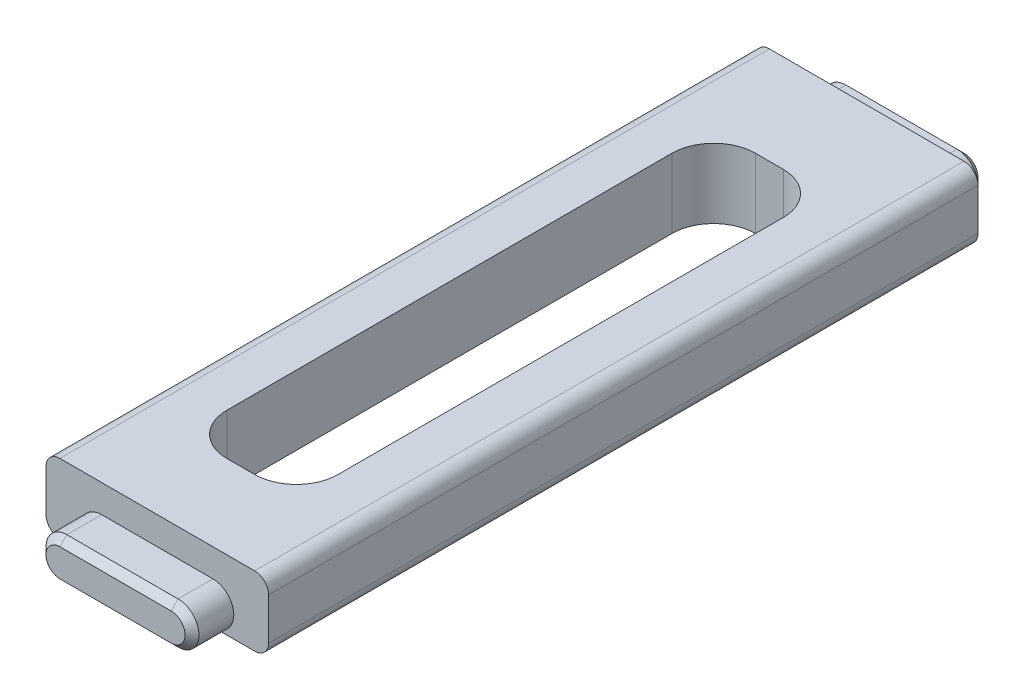
ISO-10303-21;
HEADER;
FILE_DESCRIPTION(('STEP AP214'),'2;1');
FILE_NAME('part.step','',(''),(''),'','','');
FILE_SCHEMA(('AUTOMOTIVE_DESIGN { 1 0 10303 214 1 1 1 1 }'));
ENDSEC;
DATA;
#1=APPLICATION_CONTEXT('core data for automotive mechanical design processes');
#2=APPLICATION_PROTOCOL_DEFINITION('international standard','automotive_design',2000,#1);
#3=PRODUCT_CONTEXT('',#1,'mechanical');
#4=PRODUCT('Part','Part','',(#3));
#5=PRODUCT_RELATED_PRODUCT_CATEGORY('part','',(#4));
#6=PRODUCT_DEFINITION_FORMATION('','',#4);
#7=PRODUCT_DEFINITION_CONTEXT('part definition',#1,'design');
#8=PRODUCT_DEFINITION('design','',#6,#7);
#9=PRODUCT_DEFINITION_SHAPE('','',#8);
#10=(LENGTH_UNIT() NAMED_UNIT(*) SI_UNIT(.MILLI.,.METRE.));
#11=(NAMED_UNIT(*) PLANE_ANGLE_UNIT() SI_UNIT($,.RADIAN.));
#12=(NAMED_UNIT(*) SI_UNIT($,.STERADIAN.) SOLID_ANGLE_UNIT());
#13=UNCERTAINTY_MEASURE_WITH_UNIT(LENGTH_MEASURE(1.E-05),#10,'distance_accuracy_value','');
#14=(GEOMETRIC_REPRESENTATION_CONTEXT(3) GLOBAL_UNCERTAINTY_ASSIGNED_CONTEXT((#13)) GLOBAL_UNIT_ASSIGNED_CONTEXT((#10,
#11,#12)) REPRESENTATION_CONTEXT('',''));
#15=CARTESIAN_POINT('',(0.,0.,0.));
#16=DIRECTION('',(0.,0.,1.));
#17=DIRECTION('',(1.,0.,0.));
#18=AXIS2_PLACEMENT_3D('',#15,#16,#17);
#19=CARTESIAN_POINT('',(-4.,0.,3.));
#20=DIRECTION('',(0.,0.,-1.));
#21=DIRECTION('',(-1.,0.,0.));
#22=AXIS2_PLACEMENT_3D('',#19,#20,#21);
#23=CYLINDRICAL_SURFACE('',#22,1.5);
#24=DIRECTION('',(0.,0.,-1.));
#25=VECTOR('',#24,1.);
#26=CARTESIAN_POINT('',(-4.,-1.5,3.));
#27=LINE('',#26,#25);
#28=CARTESIAN_POINT('',(-4.,-1.5,2.5));
#29=VERTEX_POINT('',#28);
#30=CARTESIAN_POINT('',(-4.,-1.5,0.));
#31=VERTEX_POINT('',#30);
#32=EDGE_CURVE('E294',#29,#31,#27,.T.);
#33=ORIENTED_EDGE('',*,*,#32,.F.);
#34=CARTESIAN_POINT('',(-4.,0.,2.5));
#35=DIRECTION('',(0.,0.,1.));
#36=DIRECTION('',(1.,0.,0.));
#37=AXIS2_PLACEMENT_3D('',#34,#35,#36);
#38=CIRCLE('',#37,1.5);
#39=CARTESIAN_POINT('',(-4.,1.5,2.5));
#40=VERTEX_POINT('',#39);
#41=EDGE_CURVE('E350',#29,#40,#38,.F.);
#42=ORIENTED_EDGE('',*,*,#41,.T.);
#43=DIRECTION('',(0.,0.,-1.));
#44=VECTOR('',#43,1.);
#45=CARTESIAN_POINT('',(-4.,1.5,3.));
#46=LINE('',#45,#44);
#47=CARTESIAN_POINT('',(-4.,1.5,0.));
#48=VERTEX_POINT('',#47);
#49=EDGE_CURVE('E288',#40,#48,#46,.T.);
#50=ORIENTED_EDGE('',*,*,#49,.T.);
#51=CARTESIAN_POINT('',(-4.,0.,0.));
#52=DIRECTION('',(0.,0.,1.));
#53=DIRECTION('',(1.,0.,0.));
#54=AXIS2_PLACEMENT_3D('',#51,#52,#53);
#55=CIRCLE('',#54,1.5);
#56=EDGE_CURVE('E268',#48,#31,#55,.T.);
#57=ORIENTED_EDGE('',*,*,#56,.T.);
#58=EDGE_LOOP('',(#33,#42,#50,#57));
#59=FACE_BOUND('',#58,.T.);
#60=ADVANCED_FACE('F34',(#59),#23,.T.);
#61=CARTESIAN_POINT('',(-4.,-1.5,3.));
#62=DIRECTION('',(0.,1.,0.));
#63=DIRECTION('',(0.,0.,1.));
#64=AXIS2_PLACEMENT_3D('',#61,#62,#63);
#65=PLANE('',#64);
#66=DIRECTION('',(-1.,0.,0.));
#67=VECTOR('',#66,1.);
#68=CARTESIAN_POINT('',(-4.,-1.5,-6.00000000000001));
#69=LINE('',#68,#67);
#70=CARTESIAN_POINT('',(1.,-1.5,-6.00000000000001));
#71=VERTEX_POINT('',#70);
#72=CARTESIAN_POINT('',(-0.999999999999997,-1.5,-6.00000000000001));
#73=VERTEX_POINT('',#72);
#74=EDGE_CURVE('E423',#71,#73,#69,.T.);
#75=ORIENTED_EDGE('',*,*,#74,.F.);
#76=CARTESIAN_POINT('',(1.,-1.5,-9.00000000000001));
#77=DIRECTION('',(0.,1.,0.));
#78=DIRECTION('',(0.,0.,1.));
#79=AXIS2_PLACEMENT_3D('',#76,#77,#78);
#80=CIRCLE('',#79,3.);
#81=CARTESIAN_POINT('',(4.,-1.5,-9.));
#82=VERTEX_POINT('',#81);
#83=EDGE_CURVE('E42',#71,#82,#80,.T.);
#84=ORIENTED_EDGE('',*,*,#83,.T.);
#85=DIRECTION('',(0.,0.,1.));
#86=VECTOR('',#85,1.);
#87=CARTESIAN_POINT('',(4.,-1.5,-44.));
#88=LINE('',#87,#86);
#89=CARTESIAN_POINT('',(4.,-1.5,-41.));
#90=VERTEX_POINT('',#89);
#91=EDGE_CURVE('E422',#90,#82,#88,.T.);
#92=ORIENTED_EDGE('',*,*,#91,.F.);
#93=CARTESIAN_POINT('',(1.,-1.5,-41.));
#94=DIRECTION('',(0.,1.,0.));
#95=DIRECTION('',(0.,0.,1.));
#96=AXIS2_PLACEMENT_3D('',#93,#94,#95);
#97=CIRCLE('',#96,3.);
#98=CARTESIAN_POINT('',(1.,-1.5,-44.));
#99=VERTEX_POINT('',#98);
#100=EDGE_CURVE('E409',#90,#99,#97,.T.);
#101=ORIENTED_EDGE('',*,*,#100,.T.);
#102=DIRECTION('',(1.,0.,0.));
#103=VECTOR('',#102,1.);
#104=CARTESIAN_POINT('',(-4.,-1.5,-44.));
#105=LINE('',#104,#103);
#106=CARTESIAN_POINT('',(-0.999999999999997,-1.5,-44.));
#107=VERTEX_POINT('',#106);
#108=EDGE_CURVE('E440',#107,#99,#105,.T.);
#109=ORIENTED_EDGE('',*,*,#108,.F.);
#110=CARTESIAN_POINT('',(-0.999999999999997,-1.5,-41.));
#111=DIRECTION('',(0.,1.,0.));
#112=DIRECTION('',(0.,0.,1.));
#113=AXIS2_PLACEMENT_3D('',#110,#111,#112);
#114=CIRCLE('',#113,3.);
#115=CARTESIAN_POINT('',(-4.,-1.5,-41.));
#116=VERTEX_POINT('',#115);
#117=EDGE_CURVE('E405',#107,#116,#114,.T.);
#118=ORIENTED_EDGE('',*,*,#117,.T.);
#119=DIRECTION('',(0.,0.,-1.));
#120=VECTOR('',#119,1.);
#121=CARTESIAN_POINT('',(-4.,-1.5,-44.));
#122=LINE('',#121,#120);
#123=CARTESIAN_POINT('',(-4.,-1.5,-9.));
#124=VERTEX_POINT('',#123);
#125=EDGE_CURVE('E446',#124,#116,#122,.T.);
#126=ORIENTED_EDGE('',*,*,#125,.F.);
#127=CARTESIAN_POINT('',(-0.999999999999997,-1.5,-9.));
#128=DIRECTION('',(0.,1.,0.));
#129=DIRECTION('',(0.,0.,1.));
#130=AXIS2_PLACEMENT_3D('',#127,#128,#129);
#131=CIRCLE('',#130,3.);
#132=EDGE_CURVE('E413',#124,#73,#131,.T.);
#133=ORIENTED_EDGE('',*,*,#132,.T.);
#134=EDGE_LOOP('',(#75,#84,#92,#101,#109,#118,#126,#133));
#135=FACE_BOUND('',#134,.T.);
#136=DIRECTION('',(0.,0.,-1.));
#137=VECTOR('',#136,1.);
#138=CARTESIAN_POINT('',(4.,-1.5,3.));
#139=LINE('',#138,#137);
#140=CARTESIAN_POINT('',(4.,-1.5,2.5));
#141=VERTEX_POINT('',#140);
#142=CARTESIAN_POINT('',(4.,-1.5,0.));
#143=VERTEX_POINT('',#142);
#144=EDGE_CURVE('E292',#141,#143,#139,.T.);
#145=ORIENTED_EDGE('',*,*,#144,.F.);
#146=DIRECTION('',(-1.,0.,0.));
#147=VECTOR('',#146,1.);
#148=CARTESIAN_POINT('',(-4.,-1.5,2.5));
#149=LINE('',#148,#147);
#150=EDGE_CURVE('E348',#141,#29,#149,.T.);
#151=ORIENTED_EDGE('',*,*,#150,.T.);
#152=ORIENTED_EDGE('',*,*,#32,.T.);
#153=DIRECTION('',(-1.,0.,0.));
#154=VECTOR('',#153,1.);
#155=CARTESIAN_POINT('',(-8.,-1.5,0.));
#156=LINE('',#155,#154);
#157=CARTESIAN_POINT('',(-7.,-1.5,0.));
#158=VERTEX_POINT('',#157);
#159=EDGE_CURVE('E277',#31,#158,#156,.T.);
#160=ORIENTED_EDGE('',*,*,#159,.T.);
#161=DIRECTION('',(0.,0.,1.));
#162=VECTOR('',#161,1.);
#163=CARTESIAN_POINT('',(-7.,-1.5,3.));
#164=LINE('',#163,#162);
#165=CARTESIAN_POINT('',(-7.,-1.5,-51.));
#166=VERTEX_POINT('',#165);
#167=EDGE_CURVE('E296',#158,#166,#164,.F.);
#168=ORIENTED_EDGE('',*,*,#167,.T.);
#169=DIRECTION('',(-1.,0.,0.));
#170=VECTOR('',#169,1.);
#171=CARTESIAN_POINT('',(-8.,-1.5,-51.));
#172=LINE('',#171,#170);
#173=CARTESIAN_POINT('',(-4.,-1.5,-51.));
#174=VERTEX_POINT('',#173);
#175=EDGE_CURVE('E265',#174,#166,#172,.T.);
#176=ORIENTED_EDGE('',*,*,#175,.F.);
#177=DIRECTION('',(0.,0.,1.));
#178=VECTOR('',#177,1.);
#179=CARTESIAN_POINT('',(-4.,-1.5,-54.));
#180=LINE('',#179,#178);
#181=CARTESIAN_POINT('',(-4.,-1.5,-53.5));
#182=VERTEX_POINT('',#181);
#183=EDGE_CURVE('E229',#182,#174,#180,.T.);
#184=ORIENTED_EDGE('',*,*,#183,.F.);
#185=DIRECTION('',(1.,0.,0.));
#186=VECTOR('',#185,1.);
#187=CARTESIAN_POINT('',(4.,-1.5,-53.5));
#188=LINE('',#187,#186);
#189=CARTESIAN_POINT('',(4.,-1.5,-53.5));
#190=VERTEX_POINT('',#189);
#191=EDGE_CURVE('E346',#182,#190,#188,.T.);
#192=ORIENTED_EDGE('',*,*,#191,.T.);
#193=DIRECTION('',(0.,0.,1.));
#194=VECTOR('',#193,1.);
#195=CARTESIAN_POINT('',(4.,-1.5,-54.));
#196=LINE('',#195,#194);
#197=CARTESIAN_POINT('',(4.,-1.5,-51.));
#198=VERTEX_POINT('',#197);
#199=EDGE_CURVE('E253',#190,#198,#196,.T.);
#200=ORIENTED_EDGE('',*,*,#199,.T.);
#201=CARTESIAN_POINT('',(7.,-1.5,-51.));
#202=VERTEX_POINT('',#201);
#203=EDGE_CURVE('E266',#202,#198,#172,.T.);
#204=ORIENTED_EDGE('',*,*,#203,.F.);
#205=DIRECTION('',(0.,0.,1.));
#206=VECTOR('',#205,1.);
#207=CARTESIAN_POINT('',(7.,-1.5,3.));
#208=LINE('',#207,#206);
#209=CARTESIAN_POINT('',(7.,-1.5,0.));
#210=VERTEX_POINT('',#209);
#211=EDGE_CURVE('E298',#202,#210,#208,.T.);
#212=ORIENTED_EDGE('',*,*,#211,.T.);
#213=EDGE_CURVE('E260',#210,#143,#156,.T.);
#214=ORIENTED_EDGE('',*,*,#213,.T.);
#215=EDGE_LOOP('',(#145,#151,#152,#160,#168,#176,#184,#192,#200,#204,#212,#214));
#216=FACE_BOUND('',#215,.T.);
#217=ADVANCED_FACE('F420',(#135,#216),#65,.F.);
#218=CARTESIAN_POINT('',(4.,0.,3.));
#219=DIRECTION('',(0.,0.,-1.));
#220=DIRECTION('',(-1.,0.,0.));
#221=AXIS2_PLACEMENT_3D('',#218,#219,#220);
#222=CYLINDRICAL_SURFACE('',#221,1.5);
#223=DIRECTION('',(0.,0.,-1.));
#224=VECTOR('',#223,1.);
#225=CARTESIAN_POINT('',(4.,1.5,3.));
#226=LINE('',#225,#224);
#227=CARTESIAN_POINT('',(4.,1.5,2.5));
#228=VERTEX_POINT('',#227);
#229=CARTESIAN_POINT('',(4.,1.5,0.));
#230=VERTEX_POINT('',#229);
#231=EDGE_CURVE('E290',#228,#230,#226,.T.);
#232=ORIENTED_EDGE('',*,*,#231,.F.);
#233=CARTESIAN_POINT('',(4.,0.,2.5));
#234=DIRECTION('',(0.,0.,1.));
#235=DIRECTION('',(1.,0.,0.));
#236=AXIS2_PLACEMENT_3D('',#233,#234,#235);
#237=CIRCLE('',#236,1.5);
#238=EDGE_CURVE('E344',#228,#141,#237,.F.);
#239=ORIENTED_EDGE('',*,*,#238,.T.);
#240=ORIENTED_EDGE('',*,*,#144,.T.);
#241=CARTESIAN_POINT('',(4.,0.,0.));
#242=DIRECTION('',(0.,0.,1.));
#243=DIRECTION('',(1.,0.,0.));
#244=AXIS2_PLACEMENT_3D('',#241,#242,#243);
#245=CIRCLE('',#244,1.5);
#246=EDGE_CURVE('E282',#143,#230,#245,.T.);
#247=ORIENTED_EDGE('',*,*,#246,.T.);
#248=EDGE_LOOP('',(#232,#239,#240,#247));
#249=FACE_BOUND('',#248,.T.);
#250=ADVANCED_FACE('F483',(#249),#222,.T.);
#251=CARTESIAN_POINT('',(-4.,1.5,3.));
#252=DIRECTION('',(0.,-1.,0.));
#253=DIRECTION('',(1.,0.,0.));
#254=AXIS2_PLACEMENT_3D('',#251,#252,#253);
#255=PLANE('',#254);
#256=ORIENTED_EDGE('',*,*,#49,.F.);
#257=DIRECTION('',(1.,0.,0.));
#258=VECTOR('',#257,1.);
#259=CARTESIAN_POINT('',(4.,1.5,2.5));
#260=LINE('',#259,#258);
#261=EDGE_CURVE('E341',#40,#228,#260,.T.);
#262=ORIENTED_EDGE('',*,*,#261,.T.);
#263=ORIENTED_EDGE('',*,*,#231,.T.);
#264=DIRECTION('',(-1.,0.,0.));
#265=VECTOR('',#264,1.);
#266=CARTESIAN_POINT('',(-4.,1.5,0.));
#267=LINE('',#266,#265);
#268=EDGE_CURVE('E285',#230,#48,#267,.T.);
#269=ORIENTED_EDGE('',*,*,#268,.T.);
#270=EDGE_LOOP('',(#256,#262,#263,#269));
#271=FACE_BOUND('',#270,.T.);
#272=ADVANCED_FACE('F580',(#271),#255,.F.);
#273=CARTESIAN_POINT('',(-4.,0.,3.));
#274=DIRECTION('',(0.,0.,1.));
#275=DIRECTION('',(1.,0.,0.));
#276=AXIS2_PLACEMENT_3D('',#273,#274,#275);
#277=PLANE('',#276);
#278=CARTESIAN_POINT('',(4.,0.,3.));
#279=DIRECTION('',(0.,0.,1.));
#280=DIRECTION('',(1.,0.,0.));
#281=AXIS2_PLACEMENT_3D('',#278,#279,#280);
#282=CIRCLE('',#281,1.);
#283=CARTESIAN_POINT('',(4.,-1.,3.));
#284=VERTEX_POINT('',#283);
#285=CARTESIAN_POINT('',(4.,1.,3.));
#286=VERTEX_POINT('',#285);
#287=EDGE_CURVE('E336',#284,#286,#282,.T.);
#288=ORIENTED_EDGE('',*,*,#287,.T.);
#289=DIRECTION('',(-1.,0.,0.));
#290=VECTOR('',#289,1.);
#291=CARTESIAN_POINT('',(-4.,1.,3.));
#292=LINE('',#291,#290);
#293=CARTESIAN_POINT('',(-4.,1.,3.));
#294=VERTEX_POINT('',#293);
#295=EDGE_CURVE('E338',#286,#294,#292,.T.);
#296=ORIENTED_EDGE('',*,*,#295,.T.);
#297=CARTESIAN_POINT('',(-4.,0.,3.));
#298=DIRECTION('',(0.,0.,1.));
#299=DIRECTION('',(1.,0.,0.));
#300=AXIS2_PLACEMENT_3D('',#297,#298,#299);
#301=CIRCLE('',#300,1.);
#302=CARTESIAN_POINT('',(-4.,-1.,3.));
#303=VERTEX_POINT('',#302);
#304=EDGE_CURVE('E332',#294,#303,#301,.T.);
#305=ORIENTED_EDGE('',*,*,#304,.T.);
#306=DIRECTION('',(1.,0.,0.));
#307=VECTOR('',#306,1.);
#308=CARTESIAN_POINT('',(4.,-1.,3.));
#309=LINE('',#308,#307);
#310=EDGE_CURVE('E334',#303,#284,#309,.T.);
#311=ORIENTED_EDGE('',*,*,#310,.T.);
#312=EDGE_LOOP('',(#288,#296,#305,#311));
#313=FACE_BOUND('',#312,.T.);
#314=ADVANCED_FACE('F576',(#313),#277,.T.);
#315=CARTESIAN_POINT('',(-8.,3.5,-51.));
#316=DIRECTION('',(1.,0.,0.));
#317=DIRECTION('',(0.,0.,-1.));
#318=AXIS2_PLACEMENT_3D('',#315,#316,#317);
#319=PLANE('',#318);
#320=DIRECTION('',(0.,1.,0.));
#321=VECTOR('',#320,1.);
#322=CARTESIAN_POINT('',(-8.,3.5,-51.));
#323=LINE('',#322,#321);
#324=CARTESIAN_POINT('',(-8.,-0.5,-51.));
#325=VERTEX_POINT('',#324);
#326=CARTESIAN_POINT('',(-8.,2.5,-51.));
#327=VERTEX_POINT('',#326);
#328=EDGE_CURVE('E256',#325,#327,#323,.T.);
#329=ORIENTED_EDGE('',*,*,#328,.F.);
#330=DIRECTION('',(0.,0.,1.));
#331=VECTOR('',#330,1.);
#332=CARTESIAN_POINT('',(-8.,-0.5,-51.));
#333=LINE('',#332,#331);
#334=CARTESIAN_POINT('',(-8.,-0.5,0.));
#335=VERTEX_POINT('',#334);
#336=EDGE_CURVE('E324',#325,#335,#333,.T.);
#337=ORIENTED_EDGE('',*,*,#336,.T.);
#338=DIRECTION('',(0.,1.,0.));
#339=VECTOR('',#338,1.);
#340=CARTESIAN_POINT('',(-8.,3.5,0.));
#341=LINE('',#340,#339);
#342=CARTESIAN_POINT('',(-8.,2.5,0.));
#343=VERTEX_POINT('',#342);
#344=EDGE_CURVE('E255',#335,#343,#341,.T.);
#345=ORIENTED_EDGE('',*,*,#344,.T.);
#346=DIRECTION('',(0.,0.,1.));
#347=VECTOR('',#346,1.);
#348=CARTESIAN_POINT('',(-8.,2.5,-51.));
#349=LINE('',#348,#347);
#350=EDGE_CURVE('E322',#343,#327,#349,.F.);
#351=ORIENTED_EDGE('',*,*,#350,.T.);
#352=EDGE_LOOP('',(#329,#337,#345,#351));
#353=FACE_BOUND('',#352,.T.);
#354=ADVANCED_FACE('F573',(#353),#319,.F.);
#355=CARTESIAN_POINT('',(8.,3.5,-51.));
#356=DIRECTION('',(0.,-1.,0.));
#357=DIRECTION('',(0.,0.,-1.));
#358=AXIS2_PLACEMENT_3D('',#355,#356,#357);
#359=PLANE('',#358);
#360=DIRECTION('',(0.,0.,-1.));
#361=VECTOR('',#360,1.);
#362=CARTESIAN_POINT('',(-4.,3.5,-44.));
#363=LINE('',#362,#361);
#364=CARTESIAN_POINT('',(-4.,3.5,-9.));
#365=VERTEX_POINT('',#364);
#366=CARTESIAN_POINT('',(-4.,3.5,-41.));
#367=VERTEX_POINT('',#366);
#368=EDGE_CURVE('E435',#365,#367,#363,.T.);
#369=ORIENTED_EDGE('',*,*,#368,.T.);
#370=CARTESIAN_POINT('',(-0.999999999999997,3.5,-41.));
#371=DIRECTION('',(0.,-1.,0.));
#372=DIRECTION('',(0.,0.,-1.));
#373=AXIS2_PLACEMENT_3D('',#370,#371,#372);
#374=CIRCLE('',#373,3.);
#375=CARTESIAN_POINT('',(-0.999999999999997,3.5,-44.));
#376=VERTEX_POINT('',#375);
#377=EDGE_CURVE('E407',#367,#376,#374,.T.);
#378=ORIENTED_EDGE('',*,*,#377,.T.);
#379=DIRECTION('',(1.,0.,0.));
#380=VECTOR('',#379,1.);
#381=CARTESIAN_POINT('',(-4.,3.5,-44.));
#382=LINE('',#381,#380);
#383=CARTESIAN_POINT('',(1.,3.5,-44.));
#384=VERTEX_POINT('',#383);
#385=EDGE_CURVE('E380',#376,#384,#382,.T.);
#386=ORIENTED_EDGE('',*,*,#385,.T.);
#387=CARTESIAN_POINT('',(1.,3.5,-41.));
#388=DIRECTION('',(0.,-1.,0.));
#389=DIRECTION('',(0.,0.,-1.));
#390=AXIS2_PLACEMENT_3D('',#387,#388,#389);
#391=CIRCLE('',#390,3.);
#392=CARTESIAN_POINT('',(4.,3.5,-41.));
#393=VERTEX_POINT('',#392);
#394=EDGE_CURVE('E411',#384,#393,#391,.T.);
#395=ORIENTED_EDGE('',*,*,#394,.T.);
#396=DIRECTION('',(0.,0.,1.));
#397=VECTOR('',#396,1.);
#398=CARTESIAN_POINT('',(4.,3.5,-44.));
#399=LINE('',#398,#397);
#400=CARTESIAN_POINT('',(4.,3.5,-9.));
#401=VERTEX_POINT('',#400);
#402=EDGE_CURVE('E436',#393,#401,#399,.T.);
#403=ORIENTED_EDGE('',*,*,#402,.T.);
#404=CARTESIAN_POINT('',(1.,3.5,-9.00000000000001));
#405=DIRECTION('',(0.,-1.,0.));
#406=DIRECTION('',(0.,0.,-1.));
#407=AXIS2_PLACEMENT_3D('',#404,#405,#406);
#408=CIRCLE('',#407,3.);
#409=CARTESIAN_POINT('',(1.,3.5,-6.00000000000001));
#410=VERTEX_POINT('',#409);
#411=EDGE_CURVE('E11',#401,#410,#408,.T.);
#412=ORIENTED_EDGE('',*,*,#411,.T.);
#413=DIRECTION('',(-1.,0.,0.));
#414=VECTOR('',#413,1.);
#415=CARTESIAN_POINT('',(-4.,3.5,-6.00000000000001));
#416=LINE('',#415,#414);
#417=CARTESIAN_POINT('',(-0.999999999999997,3.5,-6.00000000000001));
#418=VERTEX_POINT('',#417);
#419=EDGE_CURVE('E433',#410,#418,#416,.T.);
#420=ORIENTED_EDGE('',*,*,#419,.T.);
#421=CARTESIAN_POINT('',(-0.999999999999997,3.5,-9.));
#422=DIRECTION('',(0.,-1.,0.));
#423=DIRECTION('',(0.,0.,-1.));
#424=AXIS2_PLACEMENT_3D('',#421,#422,#423);
#425=CIRCLE('',#424,3.);
#426=EDGE_CURVE('E415',#418,#365,#425,.T.);
#427=ORIENTED_EDGE('',*,*,#426,.T.);
#428=EDGE_LOOP('',(#369,#378,#386,#395,#403,#412,#420,#427));
#429=FACE_BOUND('',#428,.T.);
#430=DIRECTION('',(1.,0.,0.));
#431=VECTOR('',#430,1.);
#432=CARTESIAN_POINT('',(8.,3.5,0.));
#433=LINE('',#432,#431);
#434=CARTESIAN_POINT('',(-7.,3.5,0.));
#435=VERTEX_POINT('',#434);
#436=CARTESIAN_POINT('',(7.,3.5,0.));
#437=VERTEX_POINT('',#436);
#438=EDGE_CURVE('E271',#435,#437,#433,.T.);
#439=ORIENTED_EDGE('',*,*,#438,.T.);
#440=DIRECTION('',(0.,0.,1.));
#441=VECTOR('',#440,1.);
#442=CARTESIAN_POINT('',(7.,3.5,-51.));
#443=LINE('',#442,#441);
#444=CARTESIAN_POINT('',(7.,3.5,-51.));
#445=VERTEX_POINT('',#444);
#446=EDGE_CURVE('E330',#437,#445,#443,.F.);
#447=ORIENTED_EDGE('',*,*,#446,.T.);
#448=DIRECTION('',(1.,0.,0.));
#449=VECTOR('',#448,1.);
#450=CARTESIAN_POINT('',(8.,3.5,-51.));
#451=LINE('',#450,#449);
#452=CARTESIAN_POINT('',(-7.,3.5,-51.));
#453=VERTEX_POINT('',#452);
#454=EDGE_CURVE('E259',#453,#445,#451,.T.);
#455=ORIENTED_EDGE('',*,*,#454,.F.);
#456=DIRECTION('',(0.,0.,1.));
#457=VECTOR('',#456,1.);
#458=CARTESIAN_POINT('',(-7.,3.5,-51.));
#459=LINE('',#458,#457);
#460=EDGE_CURVE('E327',#453,#435,#459,.T.);
#461=ORIENTED_EDGE('',*,*,#460,.T.);
#462=EDGE_LOOP('',(#439,#447,#455,#461));
#463=FACE_BOUND('',#462,.T.);
#464=ADVANCED_FACE('F458',(#429,#463),#359,.F.);
#465=CARTESIAN_POINT('',(8.,-1.5,-51.));
#466=DIRECTION('',(-1.,0.,0.));
#467=DIRECTION('',(0.,0.,1.));
#468=AXIS2_PLACEMENT_3D('',#465,#466,#467);
#469=PLANE('',#468);
#470=DIRECTION('',(0.,-1.,0.));
#471=VECTOR('',#470,1.);
#472=CARTESIAN_POINT('',(8.,-1.5,0.));
#473=LINE('',#472,#471);
#474=CARTESIAN_POINT('',(8.,2.5,0.));
#475=VERTEX_POINT('',#474);
#476=CARTESIAN_POINT('',(8.,-0.500000000000001,0.));
#477=VERTEX_POINT('',#476);
#478=EDGE_CURVE('E274',#475,#477,#473,.T.);
#479=ORIENTED_EDGE('',*,*,#478,.T.);
#480=DIRECTION('',(0.,0.,1.));
#481=VECTOR('',#480,1.);
#482=CARTESIAN_POINT('',(8.,-0.500000000000001,-51.));
#483=LINE('',#482,#481);
#484=CARTESIAN_POINT('',(8.,-0.500000000000001,-51.));
#485=VERTEX_POINT('',#484);
#486=EDGE_CURVE('E312',#477,#485,#483,.F.);
#487=ORIENTED_EDGE('',*,*,#486,.T.);
#488=DIRECTION('',(0.,-1.,0.));
#489=VECTOR('',#488,1.);
#490=CARTESIAN_POINT('',(8.,-1.5,-51.));
#491=LINE('',#490,#489);
#492=CARTESIAN_POINT('',(8.,2.5,-51.));
#493=VERTEX_POINT('',#492);
#494=EDGE_CURVE('E263',#493,#485,#491,.T.);
#495=ORIENTED_EDGE('',*,*,#494,.F.);
#496=DIRECTION('',(0.,0.,1.));
#497=VECTOR('',#496,1.);
#498=CARTESIAN_POINT('',(8.,2.5,-51.));
#499=LINE('',#498,#497);
#500=EDGE_CURVE('E309',#493,#475,#499,.T.);
#501=ORIENTED_EDGE('',*,*,#500,.T.);
#502=EDGE_LOOP('',(#479,#487,#495,#501));
#503=FACE_BOUND('',#502,.T.);
#504=ADVANCED_FACE('F564',(#503),#469,.F.);
#505=CARTESIAN_POINT('',(0.,0.,-51.));
#506=DIRECTION('',(0.,0.,1.));
#507=DIRECTION('',(1.,0.,0.));
#508=AXIS2_PLACEMENT_3D('',#505,#506,#507);
#509=PLANE('',#508);
#510=ORIENTED_EDGE('',*,*,#494,.T.);
#511=CARTESIAN_POINT('',(7.,-0.500000000000001,-51.));
#512=DIRECTION('',(0.,0.,1.));
#513=DIRECTION('',(1.,0.,0.));
#514=AXIS2_PLACEMENT_3D('',#511,#512,#513);
#515=CIRCLE('',#514,1.);
#516=EDGE_CURVE('E320',#485,#202,#515,.F.);
#517=ORIENTED_EDGE('',*,*,#516,.T.);
#518=ORIENTED_EDGE('',*,*,#203,.T.);
#519=CARTESIAN_POINT('',(4.,0.,-51.));
#520=DIRECTION('',(0.,0.,-1.));
#521=DIRECTION('',(-1.,0.,0.));
#522=AXIS2_PLACEMENT_3D('',#519,#520,#521);
#523=CIRCLE('',#522,1.5);
#524=CARTESIAN_POINT('',(4.,1.5,-51.));
#525=VERTEX_POINT('',#524);
#526=EDGE_CURVE('E242',#525,#198,#523,.T.);
#527=ORIENTED_EDGE('',*,*,#526,.F.);
#528=DIRECTION('',(1.,0.,0.));
#529=VECTOR('',#528,1.);
#530=CARTESIAN_POINT('',(4.,1.5,-51.));
#531=LINE('',#530,#529);
#532=CARTESIAN_POINT('',(-4.,1.5,-51.));
#533=VERTEX_POINT('',#532);
#534=EDGE_CURVE('E224',#533,#525,#531,.T.);
#535=ORIENTED_EDGE('',*,*,#534,.F.);
#536=CARTESIAN_POINT('',(-4.,0.,-51.));
#537=DIRECTION('',(0.,0.,-1.));
#538=DIRECTION('',(-1.,0.,0.));
#539=AXIS2_PLACEMENT_3D('',#536,#537,#538);
#540=CIRCLE('',#539,1.5);
#541=EDGE_CURVE('E238',#174,#533,#540,.T.);
#542=ORIENTED_EDGE('',*,*,#541,.F.);
#543=ORIENTED_EDGE('',*,*,#175,.T.);
#544=CARTESIAN_POINT('',(-7.,-0.5,-51.));
#545=DIRECTION('',(0.,0.,1.));
#546=DIRECTION('',(1.,0.,0.));
#547=AXIS2_PLACEMENT_3D('',#544,#545,#546);
#548=CIRCLE('',#547,1.);
#549=EDGE_CURVE('E318',#166,#325,#548,.F.);
#550=ORIENTED_EDGE('',*,*,#549,.T.);
#551=ORIENTED_EDGE('',*,*,#328,.T.);
#552=CARTESIAN_POINT('',(-7.,2.5,-51.));
#553=DIRECTION('',(0.,0.,1.));
#554=DIRECTION('',(1.,0.,0.));
#555=AXIS2_PLACEMENT_3D('',#552,#553,#554);
#556=CIRCLE('',#555,1.);
#557=EDGE_CURVE('E314',#327,#453,#556,.F.);
#558=ORIENTED_EDGE('',*,*,#557,.T.);
#559=ORIENTED_EDGE('',*,*,#454,.T.);
#560=CARTESIAN_POINT('',(7.,2.5,-51.));
#561=DIRECTION('',(0.,0.,1.));
#562=DIRECTION('',(1.,0.,0.));
#563=AXIS2_PLACEMENT_3D('',#560,#561,#562);
#564=CIRCLE('',#563,1.);
#565=EDGE_CURVE('E316',#445,#493,#564,.F.);
#566=ORIENTED_EDGE('',*,*,#565,.T.);
#567=EDGE_LOOP('',(#510,#517,#518,#527,#535,#542,#543,#550,#551,#558,#559,#566));
#568=FACE_BOUND('',#567,.T.);
#569=ADVANCED_FACE('F236',(#568),#509,.F.);
#570=CARTESIAN_POINT('',(0.,0.,0.));
#571=DIRECTION('',(0.,0.,1.));
#572=DIRECTION('',(1.,0.,0.));
#573=AXIS2_PLACEMENT_3D('',#570,#571,#572);
#574=PLANE('',#573);
#575=ORIENTED_EDGE('',*,*,#213,.F.);
#576=CARTESIAN_POINT('',(7.,-0.500000000000001,0.));
#577=DIRECTION('',(0.,0.,1.));
#578=DIRECTION('',(1.,0.,0.));
#579=AXIS2_PLACEMENT_3D('',#576,#577,#578);
#580=CIRCLE('',#579,1.);
#581=EDGE_CURVE('E307',#210,#477,#580,.T.);
#582=ORIENTED_EDGE('',*,*,#581,.T.);
#583=ORIENTED_EDGE('',*,*,#478,.F.);
#584=CARTESIAN_POINT('',(7.,2.5,0.));
#585=DIRECTION('',(0.,0.,1.));
#586=DIRECTION('',(1.,0.,0.));
#587=AXIS2_PLACEMENT_3D('',#584,#585,#586);
#588=CIRCLE('',#587,1.);
#589=EDGE_CURVE('E303',#475,#437,#588,.T.);
#590=ORIENTED_EDGE('',*,*,#589,.T.);
#591=ORIENTED_EDGE('',*,*,#438,.F.);
#592=CARTESIAN_POINT('',(-7.,2.5,0.));
#593=DIRECTION('',(0.,0.,1.));
#594=DIRECTION('',(1.,0.,0.));
#595=AXIS2_PLACEMENT_3D('',#592,#593,#594);
#596=CIRCLE('',#595,1.);
#597=EDGE_CURVE('E301',#435,#343,#596,.T.);
#598=ORIENTED_EDGE('',*,*,#597,.T.);
#599=ORIENTED_EDGE('',*,*,#344,.F.);
#600=CARTESIAN_POINT('',(-7.,-0.5,0.));
#601=DIRECTION('',(0.,0.,1.));
#602=DIRECTION('',(1.,0.,0.));
#603=AXIS2_PLACEMENT_3D('',#600,#601,#602);
#604=CIRCLE('',#603,1.);
#605=EDGE_CURVE('E305',#335,#158,#604,.T.);
#606=ORIENTED_EDGE('',*,*,#605,.T.);
#607=ORIENTED_EDGE('',*,*,#159,.F.);
#608=ORIENTED_EDGE('',*,*,#56,.F.);
#609=ORIENTED_EDGE('',*,*,#268,.F.);
#610=ORIENTED_EDGE('',*,*,#246,.F.);
#611=EDGE_LOOP('',(#575,#582,#583,#590,#591,#598,#599,#606,#607,#608,#609,#610));
#612=FACE_BOUND('',#611,.T.);
#613=ADVANCED_FACE('F560',(#612),#574,.T.);
#614=CARTESIAN_POINT('',(4.,0.,-54.));
#615=DIRECTION('',(0.,0.,1.));
#616=DIRECTION('',(1.,0.,0.));
#617=AXIS2_PLACEMENT_3D('',#614,#615,#616);
#618=CYLINDRICAL_SURFACE('',#617,1.5);
#619=ORIENTED_EDGE('',*,*,#199,.F.);
#620=CARTESIAN_POINT('',(4.,0.,-53.5));
#621=DIRECTION('',(0.,0.,-1.));
#622=DIRECTION('',(-1.,0.,0.));
#623=AXIS2_PLACEMENT_3D('',#620,#621,#622);
#624=CIRCLE('',#623,1.5);
#625=CARTESIAN_POINT('',(4.,1.5,-53.5));
#626=VERTEX_POINT('',#625);
#627=EDGE_CURVE('E364',#190,#626,#624,.F.);
#628=ORIENTED_EDGE('',*,*,#627,.T.);
#629=DIRECTION('',(0.,0.,1.));
#630=VECTOR('',#629,1.);
#631=CARTESIAN_POINT('',(4.,1.5,-54.));
#632=LINE('',#631,#630);
#633=EDGE_CURVE('E230',#626,#525,#632,.T.);
#634=ORIENTED_EDGE('',*,*,#633,.T.);
#635=ORIENTED_EDGE('',*,*,#526,.T.);
#636=EDGE_LOOP('',(#619,#628,#634,#635));
#637=FACE_BOUND('',#636,.T.);
#638=ADVANCED_FACE('F557',(#637),#618,.T.);
#639=CARTESIAN_POINT('',(-4.,0.,-54.));
#640=DIRECTION('',(0.,0.,1.));
#641=DIRECTION('',(1.,0.,0.));
#642=AXIS2_PLACEMENT_3D('',#639,#640,#641);
#643=CYLINDRICAL_SURFACE('',#642,1.5);
#644=DIRECTION('',(0.,0.,1.));
#645=VECTOR('',#644,1.);
#646=CARTESIAN_POINT('',(-4.,1.5,-54.));
#647=LINE('',#646,#645);
#648=CARTESIAN_POINT('',(-4.,1.5,-53.5));
#649=VERTEX_POINT('',#648);
#650=EDGE_CURVE('E220',#649,#533,#647,.T.);
#651=ORIENTED_EDGE('',*,*,#650,.F.);
#652=CARTESIAN_POINT('',(-4.,0.,-53.5));
#653=DIRECTION('',(0.,0.,-1.));
#654=DIRECTION('',(-1.,0.,0.));
#655=AXIS2_PLACEMENT_3D('',#652,#653,#654);
#656=CIRCLE('',#655,1.5);
#657=EDGE_CURVE('E362',#649,#182,#656,.F.);
#658=ORIENTED_EDGE('',*,*,#657,.T.);
#659=ORIENTED_EDGE('',*,*,#183,.T.);
#660=ORIENTED_EDGE('',*,*,#541,.T.);
#661=EDGE_LOOP('',(#651,#658,#659,#660));
#662=FACE_BOUND('',#661,.T.);
#663=ADVANCED_FACE('F244',(#662),#643,.T.);
#664=CARTESIAN_POINT('',(4.,1.5,-54.));
#665=DIRECTION('',(0.,-1.,0.));
#666=DIRECTION('',(0.,0.,-1.));
#667=AXIS2_PLACEMENT_3D('',#664,#665,#666);
#668=PLANE('',#667);
#669=ORIENTED_EDGE('',*,*,#633,.F.);
#670=DIRECTION('',(-1.,0.,0.));
#671=VECTOR('',#670,1.);
#672=CARTESIAN_POINT('',(-4.,1.5,-53.5));
#673=LINE('',#672,#671);
#674=EDGE_CURVE('E226',#626,#649,#673,.T.);
#675=ORIENTED_EDGE('',*,*,#674,.T.);
#676=ORIENTED_EDGE('',*,*,#650,.T.);
#677=ORIENTED_EDGE('',*,*,#534,.T.);
#678=EDGE_LOOP('',(#669,#675,#676,#677));
#679=FACE_BOUND('',#678,.T.);
#680=ADVANCED_FACE('F223',(#679),#668,.F.);
#681=CARTESIAN_POINT('',(4.,0.,-54.));
#682=DIRECTION('',(0.,0.,-1.));
#683=DIRECTION('',(-1.,0.,0.));
#684=AXIS2_PLACEMENT_3D('',#681,#682,#683);
#685=PLANE('',#684);
#686=CARTESIAN_POINT('',(-4.,0.,-54.));
#687=DIRECTION('',(0.,0.,-1.));
#688=DIRECTION('',(-1.,0.,0.));
#689=AXIS2_PLACEMENT_3D('',#686,#687,#688);
#690=CIRCLE('',#689,1.);
#691=CARTESIAN_POINT('',(-4.,-1.,-54.));
#692=VERTEX_POINT('',#691);
#693=CARTESIAN_POINT('',(-4.,1.,-54.));
#694=VERTEX_POINT('',#693);
#695=EDGE_CURVE('E356',#692,#694,#690,.T.);
#696=ORIENTED_EDGE('',*,*,#695,.T.);
#697=DIRECTION('',(1.,0.,0.));
#698=VECTOR('',#697,1.);
#699=CARTESIAN_POINT('',(4.,1.,-54.));
#700=LINE('',#699,#698);
#701=CARTESIAN_POINT('',(4.,1.,-54.));
#702=VERTEX_POINT('',#701);
#703=EDGE_CURVE('E358',#694,#702,#700,.T.);
#704=ORIENTED_EDGE('',*,*,#703,.T.);
#705=CARTESIAN_POINT('',(4.,0.,-54.));
#706=DIRECTION('',(0.,0.,-1.));
#707=DIRECTION('',(-1.,0.,0.));
#708=AXIS2_PLACEMENT_3D('',#705,#706,#707);
#709=CIRCLE('',#708,1.);
#710=CARTESIAN_POINT('',(4.,-1.,-54.));
#711=VERTEX_POINT('',#710);
#712=EDGE_CURVE('E352',#702,#711,#709,.T.);
#713=ORIENTED_EDGE('',*,*,#712,.T.);
#714=DIRECTION('',(-1.,0.,0.));
#715=VECTOR('',#714,1.);
#716=CARTESIAN_POINT('',(-4.,-1.,-54.));
#717=LINE('',#716,#715);
#718=EDGE_CURVE('E354',#711,#692,#717,.T.);
#719=ORIENTED_EDGE('',*,*,#718,.T.);
#720=EDGE_LOOP('',(#696,#704,#713,#719));
#721=FACE_BOUND('',#720,.T.);
#722=ADVANCED_FACE('F492',(#721),#685,.T.);
#723=CARTESIAN_POINT('',(7.,-0.500000000000001,3.));
#724=DIRECTION('',(0.,0.,1.));
#725=DIRECTION('',(1.,0.,0.));
#726=AXIS2_PLACEMENT_3D('',#723,#724,#725);
#727=CYLINDRICAL_SURFACE('',#726,1.);
#728=ORIENTED_EDGE('',*,*,#516,.F.);
#729=ORIENTED_EDGE('',*,*,#486,.F.);
#730=ORIENTED_EDGE('',*,*,#581,.F.);
#731=ORIENTED_EDGE('',*,*,#211,.F.);
#732=EDGE_LOOP('',(#728,#729,#730,#731));
#733=FACE_BOUND('',#732,.T.);
#734=ADVANCED_FACE('F488',(#733),#727,.T.);
#735=CARTESIAN_POINT('',(-7.,-0.5,-51.));
#736=DIRECTION('',(0.,0.,1.));
#737=DIRECTION('',(1.,0.,0.));
#738=AXIS2_PLACEMENT_3D('',#735,#736,#737);
#739=CYLINDRICAL_SURFACE('',#738,1.);
#740=ORIENTED_EDGE('',*,*,#549,.F.);
#741=ORIENTED_EDGE('',*,*,#167,.F.);
#742=ORIENTED_EDGE('',*,*,#605,.F.);
#743=ORIENTED_EDGE('',*,*,#336,.F.);
#744=EDGE_LOOP('',(#740,#741,#742,#743));
#745=FACE_BOUND('',#744,.T.);
#746=ADVANCED_FACE('F491',(#745),#739,.T.);
#747=CARTESIAN_POINT('',(7.,2.5,-51.));
#748=DIRECTION('',(0.,0.,1.));
#749=DIRECTION('',(1.,0.,0.));
#750=AXIS2_PLACEMENT_3D('',#747,#748,#749);
#751=CYLINDRICAL_SURFACE('',#750,1.);
#752=ORIENTED_EDGE('',*,*,#565,.F.);
#753=ORIENTED_EDGE('',*,*,#446,.F.);
#754=ORIENTED_EDGE('',*,*,#589,.F.);
#755=ORIENTED_EDGE('',*,*,#500,.F.);
#756=EDGE_LOOP('',(#752,#753,#754,#755));
#757=FACE_BOUND('',#756,.T.);
#758=ADVANCED_FACE('F496',(#757),#751,.T.);
#759=CARTESIAN_POINT('',(-7.,2.5,-51.));
#760=DIRECTION('',(0.,0.,1.));
#761=DIRECTION('',(1.,0.,0.));
#762=AXIS2_PLACEMENT_3D('',#759,#760,#761);
#763=CYLINDRICAL_SURFACE('',#762,1.);
#764=ORIENTED_EDGE('',*,*,#557,.F.);
#765=ORIENTED_EDGE('',*,*,#350,.F.);
#766=ORIENTED_EDGE('',*,*,#597,.F.);
#767=ORIENTED_EDGE('',*,*,#460,.F.);
#768=EDGE_LOOP('',(#764,#765,#766,#767));
#769=FACE_BOUND('',#768,.T.);
#770=ADVANCED_FACE('F500',(#769),#763,.T.);
#771=CARTESIAN_POINT('',(-4.,-1.,3.));
#772=DIRECTION('',(0.,-0.707106781186551,0.707106781186544));
#773=DIRECTION('',(-1.,0.,0.));
#774=AXIS2_PLACEMENT_3D('',#771,#772,#773);
#775=PLANE('',#774);
#776=DIRECTION('',(0.,0.707106781186544,0.707106781186551));
#777=VECTOR('',#776,1.);
#778=CARTESIAN_POINT('',(-4.,-1.5,2.5));
#779=LINE('',#778,#777);
#780=EDGE_CURVE('E372',#29,#303,#779,.T.);
#781=ORIENTED_EDGE('',*,*,#780,.F.);
#782=ORIENTED_EDGE('',*,*,#150,.F.);
#783=DIRECTION('',(0.,-0.707106781186544,-0.707106781186551));
#784=VECTOR('',#783,1.);
#785=CARTESIAN_POINT('',(4.,-1.,3.));
#786=LINE('',#785,#784);
#787=EDGE_CURVE('E247',#284,#141,#786,.T.);
#788=ORIENTED_EDGE('',*,*,#787,.F.);
#789=ORIENTED_EDGE('',*,*,#310,.F.);
#790=EDGE_LOOP('',(#781,#782,#788,#789));
#791=FACE_BOUND('',#790,.T.);
#792=ADVANCED_FACE('F504',(#791),#775,.T.);
#793=CARTESIAN_POINT('',(4.,0.,3.));
#794=DIRECTION('',(0.,0.,-1.));
#795=DIRECTION('',(-1.,0.,0.));
#796=AXIS2_PLACEMENT_3D('',#793,#794,#795);
#797=CONICAL_SURFACE('',#796,1.,0.785398163397443);
#798=ORIENTED_EDGE('',*,*,#787,.T.);
#799=ORIENTED_EDGE('',*,*,#238,.F.);
#800=DIRECTION('',(0.,0.707106781186544,-0.707106781186551));
#801=VECTOR('',#800,1.);
#802=CARTESIAN_POINT('',(4.,1.,3.));
#803=LINE('',#802,#801);
#804=EDGE_CURVE('E369',#286,#228,#803,.T.);
#805=ORIENTED_EDGE('',*,*,#804,.F.);
#806=ORIENTED_EDGE('',*,*,#287,.F.);
#807=EDGE_LOOP('',(#798,#799,#805,#806));
#808=FACE_BOUND('',#807,.T.);
#809=ADVANCED_FACE('F514',(#808),#797,.T.);
#810=CARTESIAN_POINT('',(-4.,0.,3.));
#811=DIRECTION('',(0.,0.,-1.));
#812=DIRECTION('',(-1.,0.,0.));
#813=AXIS2_PLACEMENT_3D('',#810,#811,#812);
#814=CONICAL_SURFACE('',#813,1.,0.785398163397443);
#815=ORIENTED_EDGE('',*,*,#780,.T.);
#816=ORIENTED_EDGE('',*,*,#304,.F.);
#817=DIRECTION('',(0.,-0.707106781186544,0.707106781186551));
#818=VECTOR('',#817,1.);
#819=CARTESIAN_POINT('',(-4.,1.5,2.5));
#820=LINE('',#819,#818);
#821=EDGE_CURVE('E367',#40,#294,#820,.T.);
#822=ORIENTED_EDGE('',*,*,#821,.F.);
#823=ORIENTED_EDGE('',*,*,#41,.F.);
#824=EDGE_LOOP('',(#815,#816,#822,#823));
#825=FACE_BOUND('',#824,.T.);
#826=ADVANCED_FACE('F510',(#825),#814,.T.);
#827=CARTESIAN_POINT('',(-4.,1.,3.));
#828=DIRECTION('',(0.,0.707106781186551,0.707106781186544));
#829=DIRECTION('',(1.,0.,0.));
#830=AXIS2_PLACEMENT_3D('',#827,#828,#829);
#831=PLANE('',#830);
#832=ORIENTED_EDGE('',*,*,#804,.T.);
#833=ORIENTED_EDGE('',*,*,#261,.F.);
#834=ORIENTED_EDGE('',*,*,#821,.T.);
#835=ORIENTED_EDGE('',*,*,#295,.F.);
#836=EDGE_LOOP('',(#832,#833,#834,#835));
#837=FACE_BOUND('',#836,.T.);
#838=ADVANCED_FACE('F506',(#837),#831,.T.);
#839=CARTESIAN_POINT('',(4.,-1.,-54.));
#840=DIRECTION('',(0.,-0.707106781186553,-0.707106781186542));
#841=DIRECTION('',(1.,0.,0.));
#842=AXIS2_PLACEMENT_3D('',#839,#840,#841);
#843=PLANE('',#842);
#844=DIRECTION('',(0.,0.707106781186542,-0.707106781186553));
#845=VECTOR('',#844,1.);
#846=CARTESIAN_POINT('',(4.,-1.5,-53.5));
#847=LINE('',#846,#845);
#848=EDGE_CURVE('E382',#190,#711,#847,.T.);
#849=ORIENTED_EDGE('',*,*,#848,.F.);
#850=ORIENTED_EDGE('',*,*,#191,.F.);
#851=DIRECTION('',(0.,-0.707106781186542,0.707106781186553));
#852=VECTOR('',#851,1.);
#853=CARTESIAN_POINT('',(-4.,-1.,-54.));
#854=LINE('',#853,#852);
#855=EDGE_CURVE('E370',#692,#182,#854,.T.);
#856=ORIENTED_EDGE('',*,*,#855,.F.);
#857=ORIENTED_EDGE('',*,*,#718,.F.);
#858=EDGE_LOOP('',(#849,#850,#856,#857));
#859=FACE_BOUND('',#858,.T.);
#860=ADVANCED_FACE('F509',(#859),#843,.T.);
#861=CARTESIAN_POINT('',(-4.,0.,-54.));
#862=DIRECTION('',(0.,0.,1.));
#863=DIRECTION('',(1.,0.,0.));
#864=AXIS2_PLACEMENT_3D('',#861,#862,#863);
#865=CONICAL_SURFACE('',#864,1.,0.785398163397441);
#866=ORIENTED_EDGE('',*,*,#855,.T.);
#867=ORIENTED_EDGE('',*,*,#657,.F.);
#868=DIRECTION('',(0.,0.707106781186542,0.707106781186553));
#869=VECTOR('',#868,1.);
#870=CARTESIAN_POINT('',(-4.,1.,-54.));
#871=LINE('',#870,#869);
#872=EDGE_CURVE('E379',#694,#649,#871,.T.);
#873=ORIENTED_EDGE('',*,*,#872,.F.);
#874=ORIENTED_EDGE('',*,*,#695,.F.);
#875=EDGE_LOOP('',(#866,#867,#873,#874));
#876=FACE_BOUND('',#875,.T.);
#877=ADVANCED_FACE('F529',(#876),#865,.T.);
#878=CARTESIAN_POINT('',(4.,0.,-54.));
#879=DIRECTION('',(0.,0.,1.));
#880=DIRECTION('',(1.,0.,0.));
#881=AXIS2_PLACEMENT_3D('',#878,#879,#880);
#882=CONICAL_SURFACE('',#881,1.,0.785398163397441);
#883=ORIENTED_EDGE('',*,*,#848,.T.);
#884=ORIENTED_EDGE('',*,*,#712,.F.);
#885=DIRECTION('',(0.,-0.707106781186542,-0.707106781186553));
#886=VECTOR('',#885,1.);
#887=CARTESIAN_POINT('',(4.,1.5,-53.5));
#888=LINE('',#887,#886);
#889=EDGE_CURVE('E377',#626,#702,#888,.T.);
#890=ORIENTED_EDGE('',*,*,#889,.F.);
#891=ORIENTED_EDGE('',*,*,#627,.F.);
#892=EDGE_LOOP('',(#883,#884,#890,#891));
#893=FACE_BOUND('',#892,.T.);
#894=ADVANCED_FACE('F525',(#893),#882,.T.);
#895=CARTESIAN_POINT('',(4.,1.,-54.));
#896=DIRECTION('',(0.,0.707106781186553,-0.707106781186542));
#897=DIRECTION('',(-1.,0.,0.));
#898=AXIS2_PLACEMENT_3D('',#895,#896,#897);
#899=PLANE('',#898);
#900=ORIENTED_EDGE('',*,*,#872,.T.);
#901=ORIENTED_EDGE('',*,*,#674,.F.);
#902=ORIENTED_EDGE('',*,*,#889,.T.);
#903=ORIENTED_EDGE('',*,*,#703,.F.);
#904=EDGE_LOOP('',(#900,#901,#902,#903));
#905=FACE_BOUND('',#904,.T.);
#906=ADVANCED_FACE('F522',(#905),#899,.T.);
#907=CARTESIAN_POINT('',(4.,3.5,-44.));
#908=DIRECTION('',(1.,0.,0.));
#909=DIRECTION('',(0.,0.,-1.));
#910=AXIS2_PLACEMENT_3D('',#907,#908,#909);
#911=PLANE('',#910);
#912=ORIENTED_EDGE('',*,*,#402,.F.);
#913=DIRECTION('',(0.,-1.,0.));
#914=VECTOR('',#913,1.);
#915=CARTESIAN_POINT('',(4.,-1.5,-41.));
#916=LINE('',#915,#914);
#917=EDGE_CURVE('E398',#393,#90,#916,.T.);
#918=ORIENTED_EDGE('',*,*,#917,.T.);
#919=ORIENTED_EDGE('',*,*,#91,.T.);
#920=DIRECTION('',(0.,-1.,0.));
#921=VECTOR('',#920,1.);
#922=CARTESIAN_POINT('',(4.,3.5,-9.00000000000001));
#923=LINE('',#922,#921);
#924=EDGE_CURVE('E396',#82,#401,#923,.F.);
#925=ORIENTED_EDGE('',*,*,#924,.T.);
#926=EDGE_LOOP('',(#912,#918,#919,#925));
#927=FACE_BOUND('',#926,.T.);
#928=ADVANCED_FACE('F429',(#927),#911,.F.);
#929=CARTESIAN_POINT('',(-4.,3.5,-44.));
#930=DIRECTION('',(0.,0.,-1.));
#931=DIRECTION('',(-1.,0.,0.));
#932=AXIS2_PLACEMENT_3D('',#929,#930,#931);
#933=PLANE('',#932);
#934=ORIENTED_EDGE('',*,*,#385,.F.);
#935=DIRECTION('',(0.,-1.,0.));
#936=VECTOR('',#935,1.);
#937=CARTESIAN_POINT('',(-0.999999999999997,-1.5,-44.));
#938=LINE('',#937,#936);
#939=EDGE_CURVE('E388',#376,#107,#938,.T.);
#940=ORIENTED_EDGE('',*,*,#939,.T.);
#941=ORIENTED_EDGE('',*,*,#108,.T.);
#942=DIRECTION('',(0.,-1.,0.));
#943=VECTOR('',#942,1.);
#944=CARTESIAN_POINT('',(1.,3.5,-44.));
#945=LINE('',#944,#943);
#946=EDGE_CURVE('E366',#99,#384,#945,.F.);
#947=ORIENTED_EDGE('',*,*,#946,.T.);
#948=EDGE_LOOP('',(#934,#940,#941,#947));
#949=FACE_BOUND('',#948,.T.);
#950=ADVANCED_FACE('F453',(#949),#933,.F.);
#951=CARTESIAN_POINT('',(-4.,3.5,-44.));
#952=DIRECTION('',(-1.,0.,0.));
#953=DIRECTION('',(0.,0.,1.));
#954=AXIS2_PLACEMENT_3D('',#951,#952,#953);
#955=PLANE('',#954);
#956=ORIENTED_EDGE('',*,*,#125,.T.);
#957=DIRECTION('',(0.,-1.,0.));
#958=VECTOR('',#957,1.);
#959=CARTESIAN_POINT('',(-4.,3.5,-41.));
#960=LINE('',#959,#958);
#961=EDGE_CURVE('E394',#116,#367,#960,.F.);
#962=ORIENTED_EDGE('',*,*,#961,.T.);
#963=ORIENTED_EDGE('',*,*,#368,.F.);
#964=DIRECTION('',(0.,-1.,0.));
#965=VECTOR('',#964,1.);
#966=CARTESIAN_POINT('',(-4.,-1.5,-9.));
#967=LINE('',#966,#965);
#968=EDGE_CURVE('E391',#365,#124,#967,.T.);
#969=ORIENTED_EDGE('',*,*,#968,.T.);
#970=EDGE_LOOP('',(#956,#962,#963,#969));
#971=FACE_BOUND('',#970,.T.);
#972=ADVANCED_FACE('F466',(#971),#955,.F.);
#973=CARTESIAN_POINT('',(-4.,3.5,-6.00000000000001));
#974=DIRECTION('',(0.,0.,1.));
#975=DIRECTION('',(1.,0.,0.));
#976=AXIS2_PLACEMENT_3D('',#973,#974,#975);
#977=PLANE('',#976);
#978=ORIENTED_EDGE('',*,*,#74,.T.);
#979=DIRECTION('',(0.,-1.,0.));
#980=VECTOR('',#979,1.);
#981=CARTESIAN_POINT('',(-0.999999999999997,3.5,-6.00000000000001));
#982=LINE('',#981,#980);
#983=EDGE_CURVE('E49',#73,#418,#982,.F.);
#984=ORIENTED_EDGE('',*,*,#983,.T.);
#985=ORIENTED_EDGE('',*,*,#419,.F.);
#986=DIRECTION('',(0.,-1.,0.));
#987=VECTOR('',#986,1.);
#988=CARTESIAN_POINT('',(1.,-1.5,-6.00000000000001));
#989=LINE('',#988,#987);
#990=EDGE_CURVE('E401',#410,#71,#989,.T.);
#991=ORIENTED_EDGE('',*,*,#990,.T.);
#992=EDGE_LOOP('',(#978,#984,#985,#991));
#993=FACE_BOUND('',#992,.T.);
#994=ADVANCED_FACE('F432',(#993),#977,.F.);
#995=CARTESIAN_POINT('',(-0.999999999999997,3.5,-41.));
#996=DIRECTION('',(0.,1.,0.));
#997=DIRECTION('',(0.,0.,1.));
#998=AXIS2_PLACEMENT_3D('',#995,#996,#997);
#999=CYLINDRICAL_SURFACE('',#998,3.);
#1000=ORIENTED_EDGE('',*,*,#377,.F.);
#1001=ORIENTED_EDGE('',*,*,#961,.F.);
#1002=ORIENTED_EDGE('',*,*,#117,.F.);
#1003=ORIENTED_EDGE('',*,*,#939,.F.);
#1004=EDGE_LOOP('',(#1000,#1001,#1002,#1003));
#1005=FACE_BOUND('',#1004,.T.);
#1006=ADVANCED_FACE('F462',(#1005),#999,.F.);
#1007=CARTESIAN_POINT('',(1.,3.5,-41.));
#1008=DIRECTION('',(0.,1.,0.));
#1009=DIRECTION('',(0.,0.,1.));
#1010=AXIS2_PLACEMENT_3D('',#1007,#1008,#1009);
#1011=CYLINDRICAL_SURFACE('',#1010,3.);
#1012=ORIENTED_EDGE('',*,*,#394,.F.);
#1013=ORIENTED_EDGE('',*,*,#946,.F.);
#1014=ORIENTED_EDGE('',*,*,#100,.F.);
#1015=ORIENTED_EDGE('',*,*,#917,.F.);
#1016=EDGE_LOOP('',(#1012,#1013,#1014,#1015));
#1017=FACE_BOUND('',#1016,.T.);
#1018=ADVANCED_FACE('F457',(#1017),#1011,.F.);
#1019=CARTESIAN_POINT('',(-0.999999999999997,3.5,-9.));
#1020=DIRECTION('',(0.,1.,0.));
#1021=DIRECTION('',(0.,0.,1.));
#1022=AXIS2_PLACEMENT_3D('',#1019,#1020,#1021);
#1023=CYLINDRICAL_SURFACE('',#1022,3.);
#1024=ORIENTED_EDGE('',*,*,#426,.F.);
#1025=ORIENTED_EDGE('',*,*,#983,.F.);
#1026=ORIENTED_EDGE('',*,*,#132,.F.);
#1027=ORIENTED_EDGE('',*,*,#968,.F.);
#1028=EDGE_LOOP('',(#1024,#1025,#1026,#1027));
#1029=FACE_BOUND('',#1028,.T.);
#1030=ADVANCED_FACE('F470',(#1029),#1023,.F.);
#1031=CARTESIAN_POINT('',(1.,3.5,-9.00000000000001));
#1032=DIRECTION('',(0.,1.,0.));
#1033=DIRECTION('',(0.,0.,1.));
#1034=AXIS2_PLACEMENT_3D('',#1031,#1032,#1033);
#1035=CYLINDRICAL_SURFACE('',#1034,3.);
#1036=ORIENTED_EDGE('',*,*,#411,.F.);
#1037=ORIENTED_EDGE('',*,*,#924,.F.);
#1038=ORIENTED_EDGE('',*,*,#83,.F.);
#1039=ORIENTED_EDGE('',*,*,#990,.F.);
#1040=EDGE_LOOP('',(#1036,#1037,#1038,#1039));
#1041=FACE_BOUND('',#1040,.T.);
#1042=ADVANCED_FACE('F36',(#1041),#1035,.F.);
#1043=CLOSED_SHELL('',(#60,#217,#250,#272,#314,#354,#464,#504,#569,#613,#638,#663,#680,#722,
#734,#746,#758,#770,#792,#809,#826,#838,#860,#877,#894,#906,#928,#950,#972,#994,#1006,#1018,
#1030,#1042));
#1044=MANIFOLD_SOLID_BREP('B2',#1043);
#1045=ADVANCED_BREP_SHAPE_REPRESENTATION('',(#18,#1044),#14);
#1046=SHAPE_DEFINITION_REPRESENTATION(#9,#1045);
ENDSEC;
END-ISO-10303-21;
